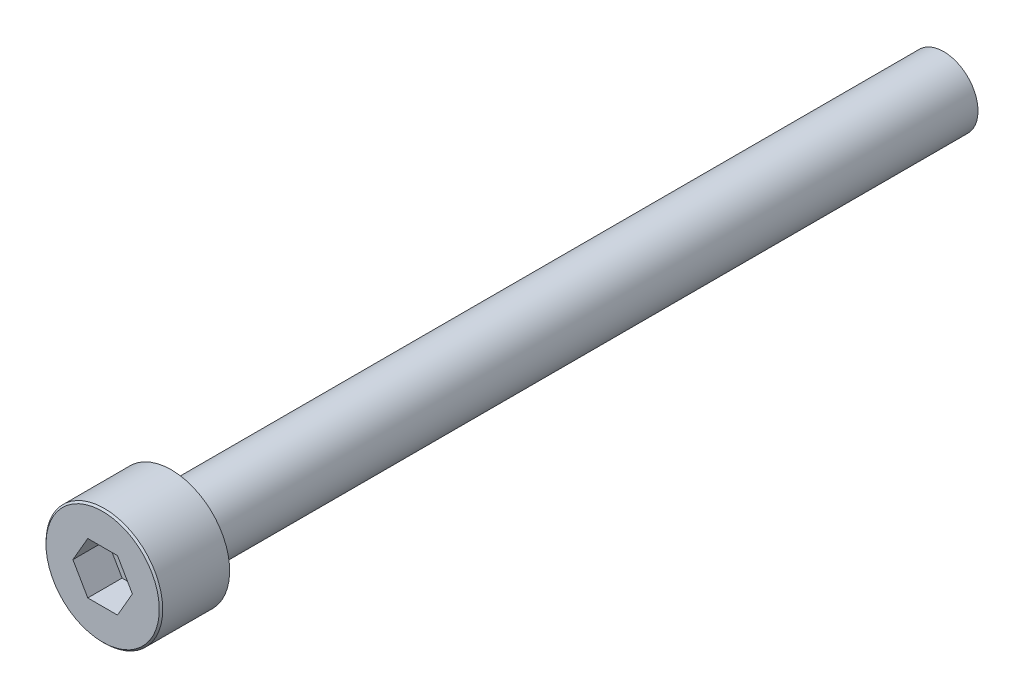
ISO-10303-21;
HEADER;
FILE_DESCRIPTION(('STEP AP214'),'2;1');
FILE_NAME('part.step','',(''),(''),'','','');
FILE_SCHEMA(('AUTOMOTIVE_DESIGN { 1 0 10303 214 1 1 1 1 }'));
ENDSEC;
DATA;
#1=APPLICATION_CONTEXT('core data for automotive mechanical design processes');
#2=APPLICATION_PROTOCOL_DEFINITION('international standard','automotive_design',2000,#1);
#3=PRODUCT_CONTEXT('',#1,'mechanical');
#4=PRODUCT('Part','Part','',(#3));
#5=PRODUCT_RELATED_PRODUCT_CATEGORY('part','',(#4));
#6=PRODUCT_DEFINITION_FORMATION('','',#4);
#7=PRODUCT_DEFINITION_CONTEXT('part definition',#1,'design');
#8=PRODUCT_DEFINITION('design','',#6,#7);
#9=PRODUCT_DEFINITION_SHAPE('','',#8);
#10=(LENGTH_UNIT() NAMED_UNIT(*) SI_UNIT(.MILLI.,.METRE.));
#11=(NAMED_UNIT(*) PLANE_ANGLE_UNIT() SI_UNIT($,.RADIAN.));
#12=(NAMED_UNIT(*) SI_UNIT($,.STERADIAN.) SOLID_ANGLE_UNIT());
#13=UNCERTAINTY_MEASURE_WITH_UNIT(LENGTH_MEASURE(1.E-05),#10,'distance_accuracy_value','');
#14=(GEOMETRIC_REPRESENTATION_CONTEXT(3) GLOBAL_UNCERTAINTY_ASSIGNED_CONTEXT((#13)) GLOBAL_UNIT_ASSIGNED_CONTEXT((#10,
#11,#12)) REPRESENTATION_CONTEXT('',''));
#15=CARTESIAN_POINT('',(0.,0.,0.));
#16=DIRECTION('',(0.,0.,1.));
#17=DIRECTION('',(1.,0.,0.));
#18=AXIS2_PLACEMENT_3D('',#15,#16,#17);
#19=CARTESIAN_POINT('',(0.,0.,0.));
#20=DIRECTION('',(0.,0.,1.));
#21=DIRECTION('',(0.,-1.,0.));
#22=AXIS2_PLACEMENT_3D('',#19,#20,#21);
#23=PLANE('',#22);
#24=CARTESIAN_POINT('',(0.,0.,0.));
#25=DIRECTION('',(0.,0.,1.));
#26=DIRECTION('',(0.,-1.,0.));
#27=AXIS2_PLACEMENT_3D('',#24,#25,#26);
#28=CIRCLE('',#27,3.3);
#29=CARTESIAN_POINT('',(0.,-3.3,0.));
#30=VERTEX_POINT('',#29);
#31=EDGE_CURVE('E11',#30,#30,#28,.T.);
#32=ORIENTED_EDGE('',*,*,#31,.T.);
#33=EDGE_LOOP('',(#32));
#34=FACE_BOUND('',#33,.T.);
#35=DIRECTION('',(-0.5,0.866025403784439,0.));
#36=VECTOR('',#35,1.);
#37=CARTESIAN_POINT('',(1.73205080756888,0.,0.));
#38=LINE('',#37,#36);
#39=CARTESIAN_POINT('',(1.73205080756888,0.,0.));
#40=VERTEX_POINT('',#39);
#41=CARTESIAN_POINT('',(0.866025403784438,1.5,0.));
#42=VERTEX_POINT('',#41);
#43=EDGE_CURVE('E58',#40,#42,#38,.T.);
#44=ORIENTED_EDGE('',*,*,#43,.F.);
#45=DIRECTION('',(0.5,0.866025403784439,0.));
#46=VECTOR('',#45,1.);
#47=CARTESIAN_POINT('',(0.866025403784439,-1.5,0.));
#48=LINE('',#47,#46);
#49=CARTESIAN_POINT('',(0.866025403784439,-1.5,0.));
#50=VERTEX_POINT('',#49);
#51=EDGE_CURVE('E141',#50,#40,#48,.T.);
#52=ORIENTED_EDGE('',*,*,#51,.F.);
#53=DIRECTION('',(1.,0.,0.));
#54=VECTOR('',#53,1.);
#55=CARTESIAN_POINT('',(-0.866025403784438,-1.5,0.));
#56=LINE('',#55,#54);
#57=CARTESIAN_POINT('',(-0.866025403784438,-1.5,0.));
#58=VERTEX_POINT('',#57);
#59=EDGE_CURVE('E139',#58,#50,#56,.T.);
#60=ORIENTED_EDGE('',*,*,#59,.F.);
#61=DIRECTION('',(0.5,-0.866025403784438,0.));
#62=VECTOR('',#61,1.);
#63=CARTESIAN_POINT('',(-1.73205080756888,0.,0.));
#64=LINE('',#63,#62);
#65=CARTESIAN_POINT('',(-1.73205080756888,0.,0.));
#66=VERTEX_POINT('',#65);
#67=EDGE_CURVE('E106',#66,#58,#64,.T.);
#68=ORIENTED_EDGE('',*,*,#67,.F.);
#69=DIRECTION('',(-0.5,-0.866025403784439,0.));
#70=VECTOR('',#69,1.);
#71=CARTESIAN_POINT('',(-0.866025403784438,1.5,0.));
#72=LINE('',#71,#70);
#73=CARTESIAN_POINT('',(-0.866025403784438,1.5,0.));
#74=VERTEX_POINT('',#73);
#75=EDGE_CURVE('E135',#74,#66,#72,.T.);
#76=ORIENTED_EDGE('',*,*,#75,.F.);
#77=DIRECTION('',(-1.,0.,0.));
#78=VECTOR('',#77,1.);
#79=CARTESIAN_POINT('',(0.866025403784438,1.5,0.));
#80=LINE('',#79,#78);
#81=EDGE_CURVE('E132',#42,#74,#80,.T.);
#82=ORIENTED_EDGE('',*,*,#81,.F.);
#83=EDGE_LOOP('',(#44,#52,#60,#68,#76,#82));
#84=FACE_BOUND('',#83,.T.);
#85=ADVANCED_FACE('F42',(#34,#84),#23,.T.);
#86=CARTESIAN_POINT('',(0.,0.,-49.));
#87=DIRECTION('',(0.,0.,-1.));
#88=DIRECTION('',(0.,1.,0.));
#89=AXIS2_PLACEMENT_3D('',#86,#87,#88);
#90=CYLINDRICAL_SURFACE('',#89,3.4);
#91=CARTESIAN_POINT('',(0.,0.,-0.100000000000003));
#92=DIRECTION('',(0.,0.,1.));
#93=DIRECTION('',(0.,-1.,0.));
#94=AXIS2_PLACEMENT_3D('',#91,#92,#93);
#95=CIRCLE('',#94,3.4);
#96=CARTESIAN_POINT('',(0.,-3.4,-0.100000000000004));
#97=VERTEX_POINT('',#96);
#98=EDGE_CURVE('E51',#97,#97,#95,.F.);
#99=ORIENTED_EDGE('',*,*,#98,.T.);
#100=EDGE_LOOP('',(#99));
#101=FACE_BOUND('',#100,.T.);
#102=CARTESIAN_POINT('',(0.,0.,-4.));
#103=DIRECTION('',(0.,0.,-1.));
#104=DIRECTION('',(0.,1.,0.));
#105=AXIS2_PLACEMENT_3D('',#102,#103,#104);
#106=CIRCLE('',#105,3.4);
#107=CARTESIAN_POINT('',(0.,3.4,-4.));
#108=VERTEX_POINT('',#107);
#109=EDGE_CURVE('E156',#108,#108,#106,.T.);
#110=ORIENTED_EDGE('',*,*,#109,.F.);
#111=EDGE_LOOP('',(#110));
#112=FACE_BOUND('',#111,.T.);
#113=ADVANCED_FACE('F161',(#101,#112),#90,.T.);
#114=CARTESIAN_POINT('',(0.,3.4,-4.));
#115=DIRECTION('',(0.,0.,-1.));
#116=DIRECTION('',(0.,1.,0.));
#117=AXIS2_PLACEMENT_3D('',#114,#115,#116);
#118=PLANE('',#117);
#119=ORIENTED_EDGE('',*,*,#109,.T.);
#120=EDGE_LOOP('',(#119));
#121=FACE_BOUND('',#120,.T.);
#122=CARTESIAN_POINT('',(0.,0.,-4.));
#123=DIRECTION('',(0.,0.,-1.));
#124=DIRECTION('',(0.,1.,0.));
#125=AXIS2_PLACEMENT_3D('',#122,#123,#124);
#126=CIRCLE('',#125,2.);
#127=CARTESIAN_POINT('',(0.,2.,-4.));
#128=VERTEX_POINT('',#127);
#129=EDGE_CURVE('E153',#128,#128,#126,.T.);
#130=ORIENTED_EDGE('',*,*,#129,.F.);
#131=EDGE_LOOP('',(#130));
#132=FACE_BOUND('',#131,.T.);
#133=ADVANCED_FACE('F177',(#121,#132),#118,.T.);
#134=CARTESIAN_POINT('',(0.,0.,-49.));
#135=DIRECTION('',(0.,0.,-1.));
#136=DIRECTION('',(0.,1.,0.));
#137=AXIS2_PLACEMENT_3D('',#134,#135,#136);
#138=CYLINDRICAL_SURFACE('',#137,1.99999999999999);
#139=ORIENTED_EDGE('',*,*,#129,.T.);
#140=EDGE_LOOP('',(#139));
#141=FACE_BOUND('',#140,.T.);
#142=CARTESIAN_POINT('',(0.,0.,-49.));
#143=DIRECTION('',(0.,0.,-1.));
#144=DIRECTION('',(0.,1.,0.));
#145=AXIS2_PLACEMENT_3D('',#142,#143,#144);
#146=CIRCLE('',#145,1.99999999999999);
#147=CARTESIAN_POINT('',(0.,2.,-49.));
#148=VERTEX_POINT('',#147);
#149=EDGE_CURVE('E145',#148,#148,#146,.T.);
#150=ORIENTED_EDGE('',*,*,#149,.F.);
#151=EDGE_LOOP('',(#150));
#152=FACE_BOUND('',#151,.T.);
#153=ADVANCED_FACE('F183',(#141,#152),#138,.T.);
#154=CARTESIAN_POINT('',(0.,2.,-49.));
#155=DIRECTION('',(0.,0.,-1.));
#156=DIRECTION('',(0.,1.,0.));
#157=AXIS2_PLACEMENT_3D('',#154,#155,#156);
#158=PLANE('',#157);
#159=ORIENTED_EDGE('',*,*,#149,.T.);
#160=EDGE_LOOP('',(#159));
#161=FACE_BOUND('',#160,.T.);
#162=ADVANCED_FACE('F187',(#161),#158,.T.);
#163=CARTESIAN_POINT('',(1.73205080756888,0.,-2.));
#164=DIRECTION('',(0.866025403784439,0.5,0.));
#165=DIRECTION('',(-0.5,0.866025403784439,0.));
#166=AXIS2_PLACEMENT_3D('',#163,#164,#165);
#167=PLANE('',#166);
#168=ORIENTED_EDGE('',*,*,#43,.T.);
#169=DIRECTION('',(0.,0.,1.));
#170=VECTOR('',#169,1.);
#171=CARTESIAN_POINT('',(0.866025403784438,1.5,-2.));
#172=LINE('',#171,#170);
#173=CARTESIAN_POINT('',(0.866025403784438,1.5,-2.));
#174=VERTEX_POINT('',#173);
#175=EDGE_CURVE('E88',#174,#42,#172,.T.);
#176=ORIENTED_EDGE('',*,*,#175,.F.);
#177=DIRECTION('',(-0.5,0.866025403784439,0.));
#178=VECTOR('',#177,1.);
#179=CARTESIAN_POINT('',(1.73205080756888,0.,-2.));
#180=LINE('',#179,#178);
#181=CARTESIAN_POINT('',(1.73205080756888,0.,-2.));
#182=VERTEX_POINT('',#181);
#183=EDGE_CURVE('E143',#182,#174,#180,.T.);
#184=ORIENTED_EDGE('',*,*,#183,.F.);
#185=DIRECTION('',(0.,0.,1.));
#186=VECTOR('',#185,1.);
#187=CARTESIAN_POINT('',(1.73205080756888,0.,-2.));
#188=LINE('',#187,#186);
#189=EDGE_CURVE('E66',#182,#40,#188,.T.);
#190=ORIENTED_EDGE('',*,*,#189,.T.);
#191=EDGE_LOOP('',(#168,#176,#184,#190));
#192=FACE_BOUND('',#191,.T.);
#193=ADVANCED_FACE('F191',(#192),#167,.F.);
#194=CARTESIAN_POINT('',(0.866025403784439,-1.5,-2.));
#195=DIRECTION('',(0.866025403784439,-0.5,0.));
#196=DIRECTION('',(0.5,0.866025403784439,0.));
#197=AXIS2_PLACEMENT_3D('',#194,#195,#196);
#198=PLANE('',#197);
#199=ORIENTED_EDGE('',*,*,#51,.T.);
#200=ORIENTED_EDGE('',*,*,#189,.F.);
#201=DIRECTION('',(0.5,0.866025403784439,0.));
#202=VECTOR('',#201,1.);
#203=CARTESIAN_POINT('',(0.866025403784439,-1.5,-2.));
#204=LINE('',#203,#202);
#205=CARTESIAN_POINT('',(0.866025403784439,-1.5,-2.));
#206=VERTEX_POINT('',#205);
#207=EDGE_CURVE('E118',#206,#182,#204,.T.);
#208=ORIENTED_EDGE('',*,*,#207,.F.);
#209=DIRECTION('',(0.,0.,1.));
#210=VECTOR('',#209,1.);
#211=CARTESIAN_POINT('',(0.866025403784439,-1.5,-2.));
#212=LINE('',#211,#210);
#213=EDGE_CURVE('E110',#206,#50,#212,.T.);
#214=ORIENTED_EDGE('',*,*,#213,.T.);
#215=EDGE_LOOP('',(#199,#200,#208,#214));
#216=FACE_BOUND('',#215,.T.);
#217=ADVANCED_FACE('F195',(#216),#198,.F.);
#218=CARTESIAN_POINT('',(-0.866025403784438,-1.5,-2.));
#219=DIRECTION('',(0.,-1.,0.));
#220=DIRECTION('',(0.,0.,-1.));
#221=AXIS2_PLACEMENT_3D('',#218,#219,#220);
#222=PLANE('',#221);
#223=ORIENTED_EDGE('',*,*,#59,.T.);
#224=ORIENTED_EDGE('',*,*,#213,.F.);
#225=DIRECTION('',(1.,0.,0.));
#226=VECTOR('',#225,1.);
#227=CARTESIAN_POINT('',(-0.866025403784438,-1.5,-2.));
#228=LINE('',#227,#226);
#229=CARTESIAN_POINT('',(-0.866025403784438,-1.5,-2.));
#230=VERTEX_POINT('',#229);
#231=EDGE_CURVE('E114',#230,#206,#228,.T.);
#232=ORIENTED_EDGE('',*,*,#231,.F.);
#233=DIRECTION('',(0.,0.,1.));
#234=VECTOR('',#233,1.);
#235=CARTESIAN_POINT('',(-0.866025403784438,-1.5,-2.));
#236=LINE('',#235,#234);
#237=EDGE_CURVE('E99',#230,#58,#236,.T.);
#238=ORIENTED_EDGE('',*,*,#237,.T.);
#239=EDGE_LOOP('',(#223,#224,#232,#238));
#240=FACE_BOUND('',#239,.T.);
#241=ADVANCED_FACE('F115',(#240),#222,.F.);
#242=CARTESIAN_POINT('',(-1.73205080756888,0.,-2.));
#243=DIRECTION('',(-0.866025403784439,-0.5,0.));
#244=DIRECTION('',(0.5,-0.866025403784439,0.));
#245=AXIS2_PLACEMENT_3D('',#242,#243,#244);
#246=PLANE('',#245);
#247=ORIENTED_EDGE('',*,*,#67,.T.);
#248=ORIENTED_EDGE('',*,*,#237,.F.);
#249=DIRECTION('',(0.5,-0.866025403784438,0.));
#250=VECTOR('',#249,1.);
#251=CARTESIAN_POINT('',(-1.73205080756888,0.,-2.));
#252=LINE('',#251,#250);
#253=CARTESIAN_POINT('',(-1.73205080756888,0.,-2.));
#254=VERTEX_POINT('',#253);
#255=EDGE_CURVE('E103',#254,#230,#252,.T.);
#256=ORIENTED_EDGE('',*,*,#255,.F.);
#257=DIRECTION('',(0.,0.,1.));
#258=VECTOR('',#257,1.);
#259=CARTESIAN_POINT('',(-1.73205080756888,0.,-2.));
#260=LINE('',#259,#258);
#261=EDGE_CURVE('E111',#254,#66,#260,.T.);
#262=ORIENTED_EDGE('',*,*,#261,.T.);
#263=EDGE_LOOP('',(#247,#248,#256,#262));
#264=FACE_BOUND('',#263,.T.);
#265=ADVANCED_FACE('F101',(#264),#246,.F.);
#266=CARTESIAN_POINT('',(-0.866025403784438,1.5,-2.));
#267=DIRECTION('',(-0.866025403784439,0.5,0.));
#268=DIRECTION('',(-0.5,-0.866025403784439,0.));
#269=AXIS2_PLACEMENT_3D('',#266,#267,#268);
#270=PLANE('',#269);
#271=ORIENTED_EDGE('',*,*,#75,.T.);
#272=ORIENTED_EDGE('',*,*,#261,.F.);
#273=DIRECTION('',(-0.5,-0.866025403784439,0.));
#274=VECTOR('',#273,1.);
#275=CARTESIAN_POINT('',(-0.866025403784438,1.5,-2.));
#276=LINE('',#275,#274);
#277=CARTESIAN_POINT('',(-0.866025403784438,1.5,-2.));
#278=VERTEX_POINT('',#277);
#279=EDGE_CURVE('E124',#278,#254,#276,.T.);
#280=ORIENTED_EDGE('',*,*,#279,.F.);
#281=DIRECTION('',(0.,0.,1.));
#282=VECTOR('',#281,1.);
#283=CARTESIAN_POINT('',(-0.866025403784438,1.5,-2.));
#284=LINE('',#283,#282);
#285=EDGE_CURVE('E148',#278,#74,#284,.T.);
#286=ORIENTED_EDGE('',*,*,#285,.T.);
#287=EDGE_LOOP('',(#271,#272,#280,#286));
#288=FACE_BOUND('',#287,.T.);
#289=ADVANCED_FACE('F198',(#288),#270,.F.);
#290=CARTESIAN_POINT('',(0.866025403784438,1.5,-2.));
#291=DIRECTION('',(0.,1.,0.));
#292=DIRECTION('',(-1.,0.,0.));
#293=AXIS2_PLACEMENT_3D('',#290,#291,#292);
#294=PLANE('',#293);
#295=ORIENTED_EDGE('',*,*,#81,.T.);
#296=ORIENTED_EDGE('',*,*,#285,.F.);
#297=DIRECTION('',(-1.,0.,0.));
#298=VECTOR('',#297,1.);
#299=CARTESIAN_POINT('',(0.866025403784438,1.5,-2.));
#300=LINE('',#299,#298);
#301=EDGE_CURVE('E126',#174,#278,#300,.T.);
#302=ORIENTED_EDGE('',*,*,#301,.F.);
#303=ORIENTED_EDGE('',*,*,#175,.T.);
#304=EDGE_LOOP('',(#295,#296,#302,#303));
#305=FACE_BOUND('',#304,.T.);
#306=ADVANCED_FACE('F169',(#305),#294,.F.);
#307=CARTESIAN_POINT('',(0.,0.,-2.));
#308=DIRECTION('',(0.,0.,1.));
#309=DIRECTION('',(1.,0.,0.));
#310=AXIS2_PLACEMENT_3D('',#307,#308,#309);
#311=PLANE('',#310);
#312=ORIENTED_EDGE('',*,*,#183,.T.);
#313=ORIENTED_EDGE('',*,*,#301,.T.);
#314=ORIENTED_EDGE('',*,*,#279,.T.);
#315=ORIENTED_EDGE('',*,*,#255,.T.);
#316=ORIENTED_EDGE('',*,*,#231,.T.);
#317=ORIENTED_EDGE('',*,*,#207,.T.);
#318=EDGE_LOOP('',(#312,#313,#314,#315,#316,#317));
#319=FACE_BOUND('',#318,.T.);
#320=ADVANCED_FACE('F121',(#319),#311,.T.);
#321=CARTESIAN_POINT('',(0.,0.,-0.100000000000003));
#322=DIRECTION('',(0.,0.,-1.));
#323=DIRECTION('',(0.,1.,0.));
#324=AXIS2_PLACEMENT_3D('',#321,#322,#323);
#325=CONICAL_SURFACE('',#324,3.4,0.78539816339744);
#326=ORIENTED_EDGE('',*,*,#31,.F.);
#327=EDGE_LOOP('',(#326));
#328=FACE_BOUND('',#327,.T.);
#329=ORIENTED_EDGE('',*,*,#98,.F.);
#330=EDGE_LOOP('',(#329));
#331=FACE_BOUND('',#330,.T.);
#332=ADVANCED_FACE('F45',(#328,#331),#325,.T.);
#333=CLOSED_SHELL('',(#85,#113,#133,#153,#162,#193,#217,#241,#265,#289,#306,#320,#332));
#334=MANIFOLD_SOLID_BREP('B2',#333);
#335=ADVANCED_BREP_SHAPE_REPRESENTATION('',(#18,#334),#14);
#336=SHAPE_DEFINITION_REPRESENTATION(#9,#335);
ENDSEC;
END-ISO-10303-21;
